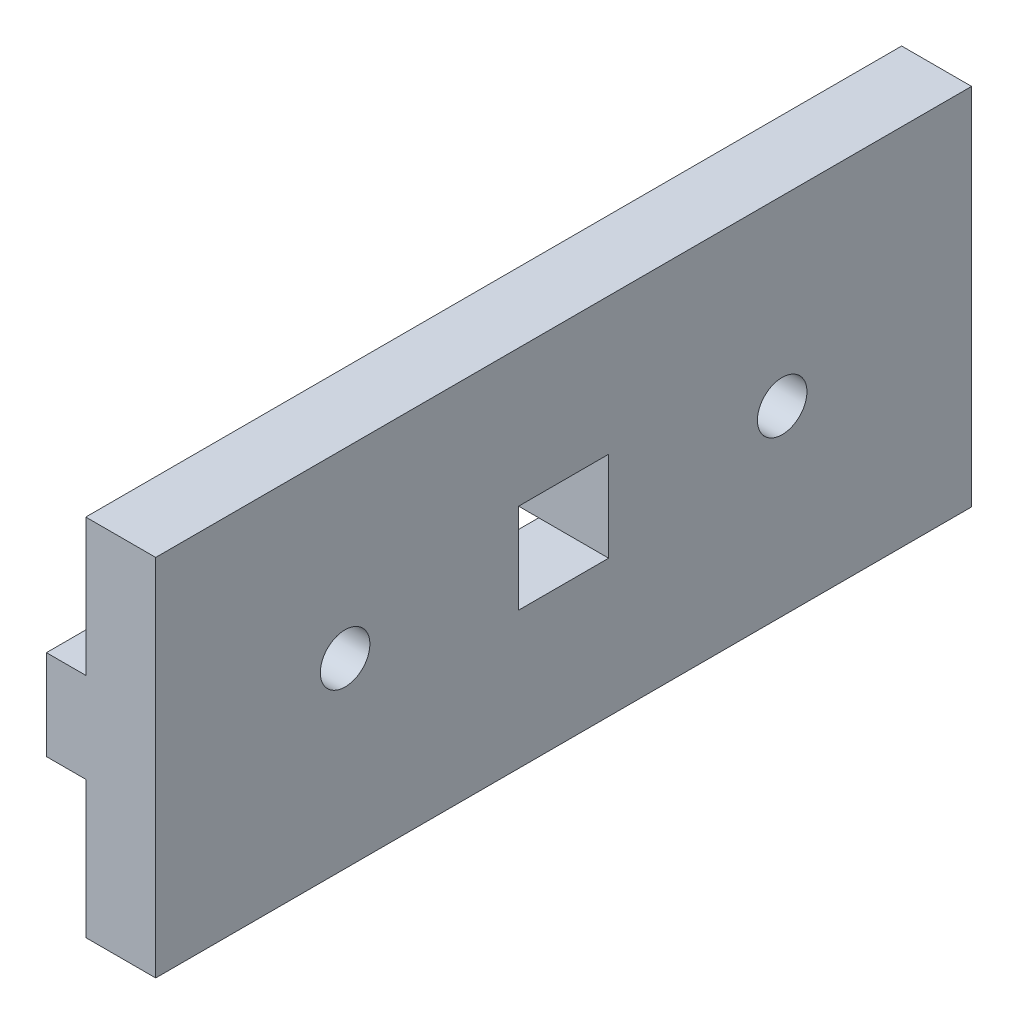
ISO-10303-21;
HEADER;
FILE_DESCRIPTION(('STEP AP214'),'2;1');
FILE_NAME('part.step','',(''),(''),'','','');
FILE_SCHEMA(('AUTOMOTIVE_DESIGN { 1 0 10303 214 1 1 1 1 }'));
ENDSEC;
DATA;
#1=APPLICATION_CONTEXT('core data for automotive mechanical design processes');
#2=APPLICATION_PROTOCOL_DEFINITION('international standard','automotive_design',2000,#1);
#3=PRODUCT_CONTEXT('',#1,'mechanical');
#4=PRODUCT('Part','Part','',(#3));
#5=PRODUCT_RELATED_PRODUCT_CATEGORY('part','',(#4));
#6=PRODUCT_DEFINITION_FORMATION('','',#4);
#7=PRODUCT_DEFINITION_CONTEXT('part definition',#1,'design');
#8=PRODUCT_DEFINITION('design','',#6,#7);
#9=PRODUCT_DEFINITION_SHAPE('','',#8);
#10=(LENGTH_UNIT() NAMED_UNIT(*) SI_UNIT(.MILLI.,.METRE.));
#11=(NAMED_UNIT(*) PLANE_ANGLE_UNIT() SI_UNIT($,.RADIAN.));
#12=(NAMED_UNIT(*) SI_UNIT($,.STERADIAN.) SOLID_ANGLE_UNIT());
#13=UNCERTAINTY_MEASURE_WITH_UNIT(LENGTH_MEASURE(1.E-05),#10,'distance_accuracy_value','');
#14=(GEOMETRIC_REPRESENTATION_CONTEXT(3) GLOBAL_UNCERTAINTY_ASSIGNED_CONTEXT((#13)) GLOBAL_UNIT_ASSIGNED_CONTEXT((#10,
#11,#12)) REPRESENTATION_CONTEXT('',''));
#15=CARTESIAN_POINT('',(0.,0.,0.));
#16=DIRECTION('',(0.,0.,1.));
#17=DIRECTION('',(1.,0.,0.));
#18=AXIS2_PLACEMENT_3D('',#15,#16,#17);
#19=CARTESIAN_POINT('',(12.5568958762887,7.8486,71.12));
#20=DIRECTION('',(0.,-1.,0.));
#21=DIRECTION('',(0.,0.,-1.));
#22=AXIS2_PLACEMENT_3D('',#19,#20,#21);
#23=PLANE('',#22);
#24=DIRECTION('',(-1.,0.,0.));
#25=VECTOR('',#24,1.);
#26=CARTESIAN_POINT('',(18.6538958762887,7.8486,31.6357));
#27=LINE('',#26,#25);
#28=CARTESIAN_POINT('',(12.5568958762887,7.8486,31.6357));
#29=VERTEX_POINT('',#28);
#30=CARTESIAN_POINT('',(9.12789587628867,7.8486,31.6357));
#31=VERTEX_POINT('',#30);
#32=EDGE_CURVE('E226',#29,#31,#27,.T.);
#33=ORIENTED_EDGE('',*,*,#32,.F.);
#34=DIRECTION('',(0.,0.,-1.));
#35=VECTOR('',#34,1.);
#36=CARTESIAN_POINT('',(12.5568958762887,7.8486,71.12));
#37=LINE('',#36,#35);
#38=CARTESIAN_POINT('',(12.5568958762887,7.8486,21.0487079119503));
#39=VERTEX_POINT('',#38);
#40=EDGE_CURVE('E372',#29,#39,#37,.T.);
#41=ORIENTED_EDGE('',*,*,#40,.T.);
#42=DIRECTION('',(-1.,0.,0.));
#43=VECTOR('',#42,1.);
#44=CARTESIAN_POINT('',(13.1278958762887,7.8486,21.0487079119503));
#45=LINE('',#44,#43);
#46=CARTESIAN_POINT('',(9.12789587628867,7.8486,21.0487079119503));
#47=VERTEX_POINT('',#46);
#48=EDGE_CURVE('E296',#39,#47,#45,.T.);
#49=ORIENTED_EDGE('',*,*,#48,.T.);
#50=DIRECTION('',(0.,0.,-1.));
#51=VECTOR('',#50,1.);
#52=CARTESIAN_POINT('',(9.12789587628867,7.8486,71.12));
#53=LINE('',#52,#51);
#54=EDGE_CURVE('E407',#31,#47,#53,.T.);
#55=ORIENTED_EDGE('',*,*,#54,.F.);
#56=EDGE_LOOP('',(#33,#41,#49,#55));
#57=FACE_BOUND('',#56,.T.);
#58=ADVANCED_FACE('F39',(#57),#23,.F.);
#59=CARTESIAN_POINT('',(9.12789587628867,7.8486,71.12));
#60=DIRECTION('',(1.,0.,0.));
#61=DIRECTION('',(0.,0.,-1.));
#62=AXIS2_PLACEMENT_3D('',#59,#60,#61);
#63=PLANE('',#62);
#64=DIRECTION('',(0.,1.,0.));
#65=VECTOR('',#64,1.);
#66=CARTESIAN_POINT('',(9.12789587628867,0.,31.6357));
#67=LINE('',#66,#65);
#68=CARTESIAN_POINT('',(9.12789587628867,0.,31.6357));
#69=VERTEX_POINT('',#68);
#70=EDGE_CURVE('E222',#69,#31,#67,.T.);
#71=ORIENTED_EDGE('',*,*,#70,.T.);
#72=ORIENTED_EDGE('',*,*,#54,.T.);
#73=CARTESIAN_POINT('',(9.12789587628867,3.9243,16.51));
#74=DIRECTION('',(-1.,0.,0.));
#75=DIRECTION('',(0.,0.,1.));
#76=AXIS2_PLACEMENT_3D('',#73,#74,#75);
#77=CIRCLE('',#76,6.);
#78=CARTESIAN_POINT('',(9.12789587628867,0.,21.0487079119503));
#79=VERTEX_POINT('',#78);
#80=EDGE_CURVE('E262',#79,#47,#77,.T.);
#81=ORIENTED_EDGE('',*,*,#80,.F.);
#82=DIRECTION('',(0.,0.,-1.));
#83=VECTOR('',#82,1.);
#84=CARTESIAN_POINT('',(9.12789587628867,0.,71.12));
#85=LINE('',#84,#83);
#86=EDGE_CURVE('E402',#69,#79,#85,.T.);
#87=ORIENTED_EDGE('',*,*,#86,.F.);
#88=EDGE_LOOP('',(#71,#72,#81,#87));
#89=FACE_BOUND('',#88,.T.);
#90=ADVANCED_FACE('F461',(#89),#63,.F.);
#91=CARTESIAN_POINT('',(9.12789587628867,0.,71.12));
#92=DIRECTION('',(0.,1.,0.));
#93=DIRECTION('',(0.,0.,1.));
#94=AXIS2_PLACEMENT_3D('',#91,#92,#93);
#95=PLANE('',#94);
#96=DIRECTION('',(-1.,0.,0.));
#97=VECTOR('',#96,1.);
#98=CARTESIAN_POINT('',(18.6538958762887,0.,31.6357));
#99=LINE('',#98,#97);
#100=CARTESIAN_POINT('',(12.5568958762887,0.,31.6357));
#101=VERTEX_POINT('',#100);
#102=EDGE_CURVE('E229',#101,#69,#99,.T.);
#103=ORIENTED_EDGE('',*,*,#102,.T.);
#104=ORIENTED_EDGE('',*,*,#86,.T.);
#105=DIRECTION('',(-1.,0.,0.));
#106=VECTOR('',#105,1.);
#107=CARTESIAN_POINT('',(13.1278958762887,0.,21.0487079119503));
#108=LINE('',#107,#106);
#109=CARTESIAN_POINT('',(12.5568958762887,0.,21.0487079119503));
#110=VERTEX_POINT('',#109);
#111=EDGE_CURVE('E304',#79,#110,#108,.F.);
#112=ORIENTED_EDGE('',*,*,#111,.T.);
#113=DIRECTION('',(0.,0.,-1.));
#114=VECTOR('',#113,1.);
#115=CARTESIAN_POINT('',(12.5568958762887,0.,71.12));
#116=LINE('',#115,#114);
#117=EDGE_CURVE('E395',#101,#110,#116,.T.);
#118=ORIENTED_EDGE('',*,*,#117,.F.);
#119=EDGE_LOOP('',(#103,#104,#112,#118));
#120=FACE_BOUND('',#119,.T.);
#121=ADVANCED_FACE('F478',(#120),#95,.F.);
#122=CARTESIAN_POINT('',(12.5568958762887,7.8486,50.0712920880497));
#123=VERTEX_POINT('',#122);
#124=CARTESIAN_POINT('',(12.5568958762887,7.8486,39.4843));
#125=VERTEX_POINT('',#124);
#126=EDGE_CURVE('E371',#123,#125,#37,.T.);
#127=ORIENTED_EDGE('',*,*,#126,.T.);
#128=DIRECTION('',(-1.,0.,0.));
#129=VECTOR('',#128,1.);
#130=CARTESIAN_POINT('',(18.6538958762887,7.8486,39.4843));
#131=LINE('',#130,#129);
#132=CARTESIAN_POINT('',(9.12789587628867,7.8486,39.4843));
#133=VERTEX_POINT('',#132);
#134=EDGE_CURVE('E207',#125,#133,#131,.T.);
#135=ORIENTED_EDGE('',*,*,#134,.T.);
#136=CARTESIAN_POINT('',(9.12789587628867,7.8486,50.0712920880497));
#137=VERTEX_POINT('',#136);
#138=EDGE_CURVE('E406',#137,#133,#53,.T.);
#139=ORIENTED_EDGE('',*,*,#138,.F.);
#140=DIRECTION('',(-1.,0.,0.));
#141=VECTOR('',#140,1.);
#142=CARTESIAN_POINT('',(13.1278958762887,7.8486,50.0712920880497));
#143=LINE('',#142,#141);
#144=EDGE_CURVE('E260',#137,#123,#143,.F.);
#145=ORIENTED_EDGE('',*,*,#144,.T.);
#146=EDGE_LOOP('',(#127,#135,#139,#145));
#147=FACE_BOUND('',#146,.T.);
#148=ADVANCED_FACE('F520',(#147),#23,.F.);
#149=CARTESIAN_POINT('',(12.5568958762887,7.8486,71.12));
#150=VERTEX_POINT('',#149);
#151=CARTESIAN_POINT('',(12.5568958762887,7.8486,59.1487079119503));
#152=VERTEX_POINT('',#151);
#153=EDGE_CURVE('E366',#150,#152,#37,.T.);
#154=ORIENTED_EDGE('',*,*,#153,.T.);
#155=DIRECTION('',(-1.,0.,0.));
#156=VECTOR('',#155,1.);
#157=CARTESIAN_POINT('',(13.1278958762887,7.8486,59.1487079119503));
#158=LINE('',#157,#156);
#159=CARTESIAN_POINT('',(9.12789587628867,7.8486,59.1487079119503));
#160=VERTEX_POINT('',#159);
#161=EDGE_CURVE('E276',#152,#160,#158,.T.);
#162=ORIENTED_EDGE('',*,*,#161,.T.);
#163=CARTESIAN_POINT('',(9.12789587628867,7.8486,71.12));
#164=VERTEX_POINT('',#163);
#165=EDGE_CURVE('E403',#164,#160,#53,.T.);
#166=ORIENTED_EDGE('',*,*,#165,.F.);
#167=DIRECTION('',(-1.,0.,0.));
#168=VECTOR('',#167,1.);
#169=CARTESIAN_POINT('',(12.5568958762887,7.8486,71.12));
#170=LINE('',#169,#168);
#171=EDGE_CURVE('E313',#150,#164,#170,.T.);
#172=ORIENTED_EDGE('',*,*,#171,.F.);
#173=EDGE_LOOP('',(#154,#162,#166,#172));
#174=FACE_BOUND('',#173,.T.);
#175=ADVANCED_FACE('F421',(#174),#23,.F.);
#176=ORIENTED_EDGE('',*,*,#138,.T.);
#177=DIRECTION('',(0.,1.,0.));
#178=VECTOR('',#177,1.);
#179=CARTESIAN_POINT('',(9.12789587628867,0.,39.4843));
#180=LINE('',#179,#178);
#181=CARTESIAN_POINT('',(9.12789587628867,0.,39.4843));
#182=VERTEX_POINT('',#181);
#183=EDGE_CURVE('E219',#182,#133,#180,.T.);
#184=ORIENTED_EDGE('',*,*,#183,.F.);
#185=CARTESIAN_POINT('',(9.12789587628867,0.,50.0712920880497));
#186=VERTEX_POINT('',#185);
#187=EDGE_CURVE('E401',#186,#182,#85,.T.);
#188=ORIENTED_EDGE('',*,*,#187,.F.);
#189=CARTESIAN_POINT('',(9.12789587628867,3.9243,54.61));
#190=DIRECTION('',(-1.,0.,0.));
#191=DIRECTION('',(0.,0.,1.));
#192=AXIS2_PLACEMENT_3D('',#189,#190,#191);
#193=CIRCLE('',#192,6.);
#194=EDGE_CURVE('E266',#137,#186,#193,.T.);
#195=ORIENTED_EDGE('',*,*,#194,.F.);
#196=EDGE_LOOP('',(#176,#184,#188,#195));
#197=FACE_BOUND('',#196,.T.);
#198=ADVANCED_FACE('F510',(#197),#63,.F.);
#199=ORIENTED_EDGE('',*,*,#165,.T.);
#200=CARTESIAN_POINT('',(9.12789587628867,0.,59.1487079119503));
#201=VERTEX_POINT('',#200);
#202=EDGE_CURVE('E267',#201,#160,#193,.T.);
#203=ORIENTED_EDGE('',*,*,#202,.F.);
#204=CARTESIAN_POINT('',(9.12789587628867,0.,71.12));
#205=VERTEX_POINT('',#204);
#206=EDGE_CURVE('E396',#205,#201,#85,.T.);
#207=ORIENTED_EDGE('',*,*,#206,.F.);
#208=DIRECTION('',(0.,-1.,0.));
#209=VECTOR('',#208,1.);
#210=CARTESIAN_POINT('',(9.12789587628867,7.8486,71.12));
#211=LINE('',#210,#209);
#212=EDGE_CURVE('E317',#164,#205,#211,.T.);
#213=ORIENTED_EDGE('',*,*,#212,.F.);
#214=EDGE_LOOP('',(#199,#203,#207,#213));
#215=FACE_BOUND('',#214,.T.);
#216=ADVANCED_FACE('F508',(#215),#63,.F.);
#217=CARTESIAN_POINT('',(12.5568958762887,0.,11.9712920880497));
#218=VERTEX_POINT('',#217);
#219=CARTESIAN_POINT('',(12.5568958762887,0.,0.));
#220=VERTEX_POINT('',#219);
#221=EDGE_CURVE('E388',#218,#220,#116,.T.);
#222=ORIENTED_EDGE('',*,*,#221,.F.);
#223=DIRECTION('',(-1.,0.,0.));
#224=VECTOR('',#223,1.);
#225=CARTESIAN_POINT('',(13.1278958762887,0.,11.9712920880497));
#226=LINE('',#225,#224);
#227=CARTESIAN_POINT('',(9.12789587628867,0.,11.9712920880497));
#228=VERTEX_POINT('',#227);
#229=EDGE_CURVE('E308',#218,#228,#226,.T.);
#230=ORIENTED_EDGE('',*,*,#229,.T.);
#231=CARTESIAN_POINT('',(9.12789587628867,0.,0.));
#232=VERTEX_POINT('',#231);
#233=EDGE_CURVE('E393',#228,#232,#85,.T.);
#234=ORIENTED_EDGE('',*,*,#233,.T.);
#235=DIRECTION('',(1.,0.,0.));
#236=VECTOR('',#235,1.);
#237=CARTESIAN_POINT('',(9.12789587628867,0.,0.));
#238=LINE('',#237,#236);
#239=EDGE_CURVE('E347',#232,#220,#238,.T.);
#240=ORIENTED_EDGE('',*,*,#239,.T.);
#241=EDGE_LOOP('',(#222,#230,#234,#240));
#242=FACE_BOUND('',#241,.T.);
#243=ADVANCED_FACE('F491',(#242),#95,.F.);
#244=ORIENTED_EDGE('',*,*,#187,.T.);
#245=DIRECTION('',(-1.,0.,0.));
#246=VECTOR('',#245,1.);
#247=CARTESIAN_POINT('',(18.6538958762887,0.,39.4843));
#248=LINE('',#247,#246);
#249=CARTESIAN_POINT('',(12.5568958762887,0.,39.4843));
#250=VERTEX_POINT('',#249);
#251=EDGE_CURVE('E208',#250,#182,#248,.T.);
#252=ORIENTED_EDGE('',*,*,#251,.F.);
#253=CARTESIAN_POINT('',(12.5568958762887,0.,50.0712920880497));
#254=VERTEX_POINT('',#253);
#255=EDGE_CURVE('E394',#254,#250,#116,.T.);
#256=ORIENTED_EDGE('',*,*,#255,.F.);
#257=DIRECTION('',(-1.,0.,0.));
#258=VECTOR('',#257,1.);
#259=CARTESIAN_POINT('',(13.1278958762887,0.,50.0712920880497));
#260=LINE('',#259,#258);
#261=EDGE_CURVE('E288',#254,#186,#260,.T.);
#262=ORIENTED_EDGE('',*,*,#261,.T.);
#263=EDGE_LOOP('',(#244,#252,#256,#262));
#264=FACE_BOUND('',#263,.T.);
#265=ADVANCED_FACE('F515',(#264),#95,.F.);
#266=CARTESIAN_POINT('',(9.12789587628867,7.8486,11.9712920880497));
#267=VERTEX_POINT('',#266);
#268=CARTESIAN_POINT('',(9.12789587628867,7.8486,0.));
#269=VERTEX_POINT('',#268);
#270=EDGE_CURVE('E400',#267,#269,#53,.T.);
#271=ORIENTED_EDGE('',*,*,#270,.F.);
#272=DIRECTION('',(-1.,0.,0.));
#273=VECTOR('',#272,1.);
#274=CARTESIAN_POINT('',(13.1278958762887,7.8486,11.9712920880497));
#275=LINE('',#274,#273);
#276=CARTESIAN_POINT('',(12.5568958762887,7.8486,11.9712920880497));
#277=VERTEX_POINT('',#276);
#278=EDGE_CURVE('E292',#267,#277,#275,.F.);
#279=ORIENTED_EDGE('',*,*,#278,.T.);
#280=CARTESIAN_POINT('',(12.5568958762887,7.8486,0.));
#281=VERTEX_POINT('',#280);
#282=EDGE_CURVE('E339',#277,#281,#37,.T.);
#283=ORIENTED_EDGE('',*,*,#282,.T.);
#284=DIRECTION('',(-1.,0.,0.));
#285=VECTOR('',#284,1.);
#286=CARTESIAN_POINT('',(12.5568958762887,7.8486,0.));
#287=LINE('',#286,#285);
#288=EDGE_CURVE('E312',#281,#269,#287,.T.);
#289=ORIENTED_EDGE('',*,*,#288,.T.);
#290=EDGE_LOOP('',(#271,#279,#283,#289));
#291=FACE_BOUND('',#290,.T.);
#292=ADVANCED_FACE('F41',(#291),#23,.F.);
#293=ORIENTED_EDGE('',*,*,#233,.F.);
#294=EDGE_CURVE('E261',#267,#228,#77,.T.);
#295=ORIENTED_EDGE('',*,*,#294,.F.);
#296=ORIENTED_EDGE('',*,*,#270,.T.);
#297=DIRECTION('',(0.,-1.,0.));
#298=VECTOR('',#297,1.);
#299=CARTESIAN_POINT('',(9.12789587628867,7.8486,0.));
#300=LINE('',#299,#298);
#301=EDGE_CURVE('E343',#269,#232,#300,.T.);
#302=ORIENTED_EDGE('',*,*,#301,.T.);
#303=EDGE_LOOP('',(#293,#295,#296,#302));
#304=FACE_BOUND('',#303,.T.);
#305=ADVANCED_FACE('F468',(#304),#63,.F.);
#306=ORIENTED_EDGE('',*,*,#206,.T.);
#307=DIRECTION('',(-1.,0.,0.));
#308=VECTOR('',#307,1.);
#309=CARTESIAN_POINT('',(13.1278958762887,0.,59.1487079119503));
#310=LINE('',#309,#308);
#311=CARTESIAN_POINT('',(12.5568958762887,0.,59.1487079119503));
#312=VERTEX_POINT('',#311);
#313=EDGE_CURVE('E284',#201,#312,#310,.F.);
#314=ORIENTED_EDGE('',*,*,#313,.T.);
#315=CARTESIAN_POINT('',(12.5568958762887,0.,71.12));
#316=VERTEX_POINT('',#315);
#317=EDGE_CURVE('E389',#316,#312,#116,.T.);
#318=ORIENTED_EDGE('',*,*,#317,.F.);
#319=DIRECTION('',(1.,0.,0.));
#320=VECTOR('',#319,1.);
#321=CARTESIAN_POINT('',(9.12789587628867,0.,71.12));
#322=LINE('',#321,#320);
#323=EDGE_CURVE('E321',#205,#316,#322,.T.);
#324=ORIENTED_EDGE('',*,*,#323,.F.);
#325=EDGE_LOOP('',(#306,#314,#318,#324));
#326=FACE_BOUND('',#325,.T.);
#327=ADVANCED_FACE('F504',(#326),#95,.F.);
#328=CARTESIAN_POINT('',(12.5568958762887,0.,71.12));
#329=DIRECTION('',(1.,0.,0.));
#330=DIRECTION('',(0.,0.,-1.));
#331=AXIS2_PLACEMENT_3D('',#328,#329,#330);
#332=PLANE('',#331);
#333=ORIENTED_EDGE('',*,*,#255,.T.);
#334=DIRECTION('',(0.,0.,-1.));
#335=VECTOR('',#334,1.);
#336=CARTESIAN_POINT('',(12.5568958762887,0.,71.12));
#337=LINE('',#336,#335);
#338=EDGE_CURVE('E205',#250,#101,#337,.T.);
#339=ORIENTED_EDGE('',*,*,#338,.T.);
#340=ORIENTED_EDGE('',*,*,#117,.T.);
#341=CARTESIAN_POINT('',(12.5568958762887,3.9243,16.51));
#342=DIRECTION('',(1.,0.,0.));
#343=DIRECTION('',(0.,0.,-1.));
#344=AXIS2_PLACEMENT_3D('',#341,#342,#343);
#345=CIRCLE('',#344,6.);
#346=EDGE_CURVE('E300',#110,#218,#345,.T.);
#347=ORIENTED_EDGE('',*,*,#346,.T.);
#348=ORIENTED_EDGE('',*,*,#221,.T.);
#349=DIRECTION('',(0.,-1.,0.));
#350=VECTOR('',#349,1.);
#351=CARTESIAN_POINT('',(12.5568958762887,0.,0.));
#352=LINE('',#351,#350);
#353=CARTESIAN_POINT('',(12.5568958762887,-11.9507,0.));
#354=VERTEX_POINT('',#353);
#355=EDGE_CURVE('E351',#220,#354,#352,.T.);
#356=ORIENTED_EDGE('',*,*,#355,.T.);
#357=DIRECTION('',(0.,0.,-1.));
#358=VECTOR('',#357,1.);
#359=CARTESIAN_POINT('',(12.5568958762887,-11.9507,71.12));
#360=LINE('',#359,#358);
#361=CARTESIAN_POINT('',(12.5568958762887,-11.9507,71.12));
#362=VERTEX_POINT('',#361);
#363=EDGE_CURVE('E384',#362,#354,#360,.T.);
#364=ORIENTED_EDGE('',*,*,#363,.F.);
#365=DIRECTION('',(0.,-1.,0.));
#366=VECTOR('',#365,1.);
#367=CARTESIAN_POINT('',(12.5568958762887,0.,71.12));
#368=LINE('',#367,#366);
#369=EDGE_CURVE('E324',#316,#362,#368,.T.);
#370=ORIENTED_EDGE('',*,*,#369,.F.);
#371=ORIENTED_EDGE('',*,*,#317,.T.);
#372=CARTESIAN_POINT('',(12.5568958762887,3.9243,54.61));
#373=DIRECTION('',(1.,0.,0.));
#374=DIRECTION('',(0.,0.,-1.));
#375=AXIS2_PLACEMENT_3D('',#372,#373,#374);
#376=CIRCLE('',#375,6.);
#377=EDGE_CURVE('E280',#312,#254,#376,.T.);
#378=ORIENTED_EDGE('',*,*,#377,.T.);
#379=EDGE_LOOP('',(#333,#339,#340,#347,#348,#356,#364,#370,#371,#378));
#380=FACE_BOUND('',#379,.T.);
#381=ADVANCED_FACE('F482',(#380),#332,.F.);
#382=CARTESIAN_POINT('',(12.5568958762887,-11.9507,71.12));
#383=DIRECTION('',(0.,1.,0.));
#384=DIRECTION('',(0.,0.,1.));
#385=AXIS2_PLACEMENT_3D('',#382,#383,#384);
#386=PLANE('',#385);
#387=DIRECTION('',(1.,0.,0.));
#388=VECTOR('',#387,1.);
#389=CARTESIAN_POINT('',(12.5568958762887,-11.9507,0.));
#390=LINE('',#389,#388);
#391=CARTESIAN_POINT('',(18.6528958762887,-11.9507,0.));
#392=VERTEX_POINT('',#391);
#393=EDGE_CURVE('E354',#354,#392,#390,.T.);
#394=ORIENTED_EDGE('',*,*,#393,.T.);
#395=DIRECTION('',(0.,0.,-1.));
#396=VECTOR('',#395,1.);
#397=CARTESIAN_POINT('',(18.6528958762887,-11.9507,71.12));
#398=LINE('',#397,#396);
#399=CARTESIAN_POINT('',(18.6528958762887,-11.9507,71.12));
#400=VERTEX_POINT('',#399);
#401=EDGE_CURVE('E380',#400,#392,#398,.T.);
#402=ORIENTED_EDGE('',*,*,#401,.F.);
#403=DIRECTION('',(1.,0.,0.));
#404=VECTOR('',#403,1.);
#405=CARTESIAN_POINT('',(12.5568958762887,-11.9507,71.12));
#406=LINE('',#405,#404);
#407=EDGE_CURVE('E327',#362,#400,#406,.T.);
#408=ORIENTED_EDGE('',*,*,#407,.F.);
#409=ORIENTED_EDGE('',*,*,#363,.T.);
#410=EDGE_LOOP('',(#394,#402,#408,#409));
#411=FACE_BOUND('',#410,.T.);
#412=ADVANCED_FACE('F495',(#411),#386,.F.);
#413=CARTESIAN_POINT('',(18.6528958762887,-11.9507,71.12));
#414=DIRECTION('',(-1.,0.,0.));
#415=DIRECTION('',(0.,0.,1.));
#416=AXIS2_PLACEMENT_3D('',#413,#414,#415);
#417=PLANE('',#416);
#418=DIRECTION('',(0.,0.,-1.));
#419=VECTOR('',#418,1.);
#420=CARTESIAN_POINT('',(18.6528958762887,0.,31.6357));
#421=LINE('',#420,#419);
#422=CARTESIAN_POINT('',(18.6528958762887,0.,39.4843));
#423=VERTEX_POINT('',#422);
#424=CARTESIAN_POINT('',(18.6528958762887,0.,31.6357));
#425=VERTEX_POINT('',#424);
#426=EDGE_CURVE('E198',#423,#425,#421,.T.);
#427=ORIENTED_EDGE('',*,*,#426,.F.);
#428=DIRECTION('',(0.,-1.,0.));
#429=VECTOR('',#428,1.);
#430=CARTESIAN_POINT('',(18.6528958762887,0.,39.4843));
#431=LINE('',#430,#429);
#432=CARTESIAN_POINT('',(18.6528958762887,7.8486,39.4843));
#433=VERTEX_POINT('',#432);
#434=EDGE_CURVE('E188',#433,#423,#431,.T.);
#435=ORIENTED_EDGE('',*,*,#434,.F.);
#436=DIRECTION('',(0.,0.,-1.));
#437=VECTOR('',#436,1.);
#438=CARTESIAN_POINT('',(18.6528958762887,7.8486,31.6357));
#439=LINE('',#438,#437);
#440=CARTESIAN_POINT('',(18.6528958762887,7.8486,31.6357));
#441=VERTEX_POINT('',#440);
#442=EDGE_CURVE('E197',#433,#441,#439,.T.);
#443=ORIENTED_EDGE('',*,*,#442,.T.);
#444=DIRECTION('',(0.,-1.,0.));
#445=VECTOR('',#444,1.);
#446=CARTESIAN_POINT('',(18.6528958762887,0.,31.6357));
#447=LINE('',#446,#445);
#448=EDGE_CURVE('E213',#441,#425,#447,.T.);
#449=ORIENTED_EDGE('',*,*,#448,.T.);
#450=EDGE_LOOP('',(#427,#435,#443,#449));
#451=FACE_BOUND('',#450,.T.);
#452=CARTESIAN_POINT('',(18.6528958762887,3.9243,16.51));
#453=DIRECTION('',(-1.,0.,0.));
#454=DIRECTION('',(0.,0.,1.));
#455=AXIS2_PLACEMENT_3D('',#452,#453,#454);
#456=CIRCLE('',#455,2.16);
#457=CARTESIAN_POINT('',(18.6528958762887,3.9243,18.67));
#458=VERTEX_POINT('',#457);
#459=EDGE_CURVE('E244',#458,#458,#456,.F.);
#460=ORIENTED_EDGE('',*,*,#459,.F.);
#461=EDGE_LOOP('',(#460));
#462=FACE_BOUND('',#461,.T.);
#463=CARTESIAN_POINT('',(18.6528958762887,3.9243,54.61));
#464=DIRECTION('',(-1.,0.,0.));
#465=DIRECTION('',(0.,0.,1.));
#466=AXIS2_PLACEMENT_3D('',#463,#464,#465);
#467=CIRCLE('',#466,2.16);
#468=CARTESIAN_POINT('',(18.6528958762887,3.9243,56.77));
#469=VERTEX_POINT('',#468);
#470=EDGE_CURVE('E239',#469,#469,#467,.F.);
#471=ORIENTED_EDGE('',*,*,#470,.F.);
#472=EDGE_LOOP('',(#471));
#473=FACE_BOUND('',#472,.T.);
#474=DIRECTION('',(0.,1.,0.));
#475=VECTOR('',#474,1.);
#476=CARTESIAN_POINT('',(18.6528958762887,-11.9507,0.));
#477=LINE('',#476,#475);
#478=CARTESIAN_POINT('',(18.6528958762887,19.7993,0.));
#479=VERTEX_POINT('',#478);
#480=EDGE_CURVE('E357',#392,#479,#477,.T.);
#481=ORIENTED_EDGE('',*,*,#480,.T.);
#482=DIRECTION('',(0.,0.,-1.));
#483=VECTOR('',#482,1.);
#484=CARTESIAN_POINT('',(18.6528958762887,19.7993,71.12));
#485=LINE('',#484,#483);
#486=CARTESIAN_POINT('',(18.6528958762887,19.7993,71.12));
#487=VERTEX_POINT('',#486);
#488=EDGE_CURVE('E376',#487,#479,#485,.T.);
#489=ORIENTED_EDGE('',*,*,#488,.F.);
#490=DIRECTION('',(0.,1.,0.));
#491=VECTOR('',#490,1.);
#492=CARTESIAN_POINT('',(18.6528958762887,-11.9507,71.12));
#493=LINE('',#492,#491);
#494=EDGE_CURVE('E330',#400,#487,#493,.T.);
#495=ORIENTED_EDGE('',*,*,#494,.F.);
#496=ORIENTED_EDGE('',*,*,#401,.T.);
#497=EDGE_LOOP('',(#481,#489,#495,#496));
#498=FACE_BOUND('',#497,.T.);
#499=ADVANCED_FACE('F211',(#451,#462,#473,#498),#417,.F.);
#500=CARTESIAN_POINT('',(18.6528958762887,19.7993,71.12));
#501=DIRECTION('',(0.,-1.,0.));
#502=DIRECTION('',(0.,0.,-1.));
#503=AXIS2_PLACEMENT_3D('',#500,#501,#502);
#504=PLANE('',#503);
#505=DIRECTION('',(-1.,0.,0.));
#506=VECTOR('',#505,1.);
#507=CARTESIAN_POINT('',(18.6528958762887,19.7993,0.));
#508=LINE('',#507,#506);
#509=CARTESIAN_POINT('',(12.5568958762887,19.7993,0.));
#510=VERTEX_POINT('',#509);
#511=EDGE_CURVE('E360',#479,#510,#508,.T.);
#512=ORIENTED_EDGE('',*,*,#511,.T.);
#513=DIRECTION('',(0.,0.,-1.));
#514=VECTOR('',#513,1.);
#515=CARTESIAN_POINT('',(12.5568958762887,19.7993,71.12));
#516=LINE('',#515,#514);
#517=CARTESIAN_POINT('',(12.5568958762887,19.7993,71.12));
#518=VERTEX_POINT('',#517);
#519=EDGE_CURVE('E370',#518,#510,#516,.T.);
#520=ORIENTED_EDGE('',*,*,#519,.F.);
#521=DIRECTION('',(-1.,0.,0.));
#522=VECTOR('',#521,1.);
#523=CARTESIAN_POINT('',(18.6528958762887,19.7993,71.12));
#524=LINE('',#523,#522);
#525=EDGE_CURVE('E333',#487,#518,#524,.T.);
#526=ORIENTED_EDGE('',*,*,#525,.F.);
#527=ORIENTED_EDGE('',*,*,#488,.T.);
#528=EDGE_LOOP('',(#512,#520,#526,#527));
#529=FACE_BOUND('',#528,.T.);
#530=ADVANCED_FACE('F574',(#529),#504,.F.);
#531=CARTESIAN_POINT('',(12.5568958762887,19.7993,71.12));
#532=DIRECTION('',(1.,0.,0.));
#533=DIRECTION('',(0.,0.,-1.));
#534=AXIS2_PLACEMENT_3D('',#531,#532,#533);
#535=PLANE('',#534);
#536=ORIENTED_EDGE('',*,*,#282,.F.);
#537=CARTESIAN_POINT('',(12.5568958762887,3.9243,16.51));
#538=DIRECTION('',(1.,0.,0.));
#539=DIRECTION('',(0.,0.,-1.));
#540=AXIS2_PLACEMENT_3D('',#537,#538,#539);
#541=CIRCLE('',#540,6.);
#542=EDGE_CURVE('E11',#277,#39,#541,.T.);
#543=ORIENTED_EDGE('',*,*,#542,.T.);
#544=ORIENTED_EDGE('',*,*,#40,.F.);
#545=EDGE_CURVE('E440',#125,#29,#37,.T.);
#546=ORIENTED_EDGE('',*,*,#545,.F.);
#547=ORIENTED_EDGE('',*,*,#126,.F.);
#548=CARTESIAN_POINT('',(12.5568958762887,3.9243,54.61));
#549=DIRECTION('',(1.,0.,0.));
#550=DIRECTION('',(0.,0.,-1.));
#551=AXIS2_PLACEMENT_3D('',#548,#549,#550);
#552=CIRCLE('',#551,6.);
#553=EDGE_CURVE('E48',#123,#152,#552,.T.);
#554=ORIENTED_EDGE('',*,*,#553,.T.);
#555=ORIENTED_EDGE('',*,*,#153,.F.);
#556=DIRECTION('',(0.,-1.,0.));
#557=VECTOR('',#556,1.);
#558=CARTESIAN_POINT('',(12.5568958762887,19.7993,71.12));
#559=LINE('',#558,#557);
#560=EDGE_CURVE('E336',#518,#150,#559,.T.);
#561=ORIENTED_EDGE('',*,*,#560,.F.);
#562=ORIENTED_EDGE('',*,*,#519,.T.);
#563=DIRECTION('',(0.,-1.,0.));
#564=VECTOR('',#563,1.);
#565=CARTESIAN_POINT('',(12.5568958762887,19.7993,0.));
#566=LINE('',#565,#564);
#567=EDGE_CURVE('E318',#510,#281,#566,.T.);
#568=ORIENTED_EDGE('',*,*,#567,.T.);
#569=EDGE_LOOP('',(#536,#543,#544,#546,#547,#554,#555,#561,#562,#568));
#570=FACE_BOUND('',#569,.T.);
#571=ADVANCED_FACE('F414',(#570),#535,.F.);
#572=CARTESIAN_POINT('',(0.,0.,71.12));
#573=DIRECTION('',(0.,0.,1.));
#574=DIRECTION('',(1.,0.,0.));
#575=AXIS2_PLACEMENT_3D('',#572,#573,#574);
#576=PLANE('',#575);
#577=ORIENTED_EDGE('',*,*,#171,.T.);
#578=ORIENTED_EDGE('',*,*,#212,.T.);
#579=ORIENTED_EDGE('',*,*,#323,.T.);
#580=ORIENTED_EDGE('',*,*,#369,.T.);
#581=ORIENTED_EDGE('',*,*,#407,.T.);
#582=ORIENTED_EDGE('',*,*,#494,.T.);
#583=ORIENTED_EDGE('',*,*,#525,.T.);
#584=ORIENTED_EDGE('',*,*,#560,.T.);
#585=EDGE_LOOP('',(#577,#578,#579,#580,#581,#582,#583,#584));
#586=FACE_BOUND('',#585,.T.);
#587=ADVANCED_FACE('F424',(#586),#576,.T.);
#588=CARTESIAN_POINT('',(0.,0.,0.));
#589=DIRECTION('',(0.,0.,1.));
#590=DIRECTION('',(1.,0.,0.));
#591=AXIS2_PLACEMENT_3D('',#588,#589,#590);
#592=PLANE('',#591);
#593=ORIENTED_EDGE('',*,*,#288,.F.);
#594=ORIENTED_EDGE('',*,*,#567,.F.);
#595=ORIENTED_EDGE('',*,*,#511,.F.);
#596=ORIENTED_EDGE('',*,*,#480,.F.);
#597=ORIENTED_EDGE('',*,*,#393,.F.);
#598=ORIENTED_EDGE('',*,*,#355,.F.);
#599=ORIENTED_EDGE('',*,*,#239,.F.);
#600=ORIENTED_EDGE('',*,*,#301,.F.);
#601=EDGE_LOOP('',(#593,#594,#595,#596,#597,#598,#599,#600));
#602=FACE_BOUND('',#601,.T.);
#603=ADVANCED_FACE('F433',(#602),#592,.F.);
#604=CARTESIAN_POINT('',(13.1278958762887,3.9243,54.61));
#605=DIRECTION('',(-1.,0.,0.));
#606=DIRECTION('',(0.,0.,1.));
#607=AXIS2_PLACEMENT_3D('',#604,#605,#606);
#608=CYLINDRICAL_SURFACE('',#607,6.);
#609=CARTESIAN_POINT('',(13.1278958762887,3.9243,54.61));
#610=DIRECTION('',(-1.,0.,0.));
#611=DIRECTION('',(0.,0.,1.));
#612=AXIS2_PLACEMENT_3D('',#609,#610,#611);
#613=CIRCLE('',#612,6.);
#614=CARTESIAN_POINT('',(13.1278958762887,3.9243,60.61));
#615=VERTEX_POINT('',#614);
#616=EDGE_CURVE('E249',#615,#615,#613,.T.);
#617=ORIENTED_EDGE('',*,*,#616,.F.);
#618=EDGE_LOOP('',(#617));
#619=FACE_BOUND('',#618,.T.);
#620=ORIENTED_EDGE('',*,*,#377,.F.);
#621=ORIENTED_EDGE('',*,*,#313,.F.);
#622=ORIENTED_EDGE('',*,*,#202,.T.);
#623=ORIENTED_EDGE('',*,*,#161,.F.);
#624=ORIENTED_EDGE('',*,*,#553,.F.);
#625=ORIENTED_EDGE('',*,*,#144,.F.);
#626=ORIENTED_EDGE('',*,*,#194,.T.);
#627=ORIENTED_EDGE('',*,*,#261,.F.);
#628=EDGE_LOOP('',(#620,#621,#622,#623,#624,#625,#626,#627));
#629=FACE_BOUND('',#628,.T.);
#630=ADVANCED_FACE('F506',(#619,#629),#608,.F.);
#631=CARTESIAN_POINT('',(13.1278958762887,3.9243,54.61));
#632=DIRECTION('',(-1.,0.,0.));
#633=DIRECTION('',(0.,0.,1.));
#634=AXIS2_PLACEMENT_3D('',#631,#632,#633);
#635=PLANE('',#634);
#636=CARTESIAN_POINT('',(13.1278958762887,3.9243,54.61));
#637=DIRECTION('',(-1.,0.,0.));
#638=DIRECTION('',(0.,0.,1.));
#639=AXIS2_PLACEMENT_3D('',#636,#637,#638);
#640=CIRCLE('',#639,2.16);
#641=CARTESIAN_POINT('',(13.1278958762887,3.9243,56.77));
#642=VERTEX_POINT('',#641);
#643=EDGE_CURVE('E245',#642,#642,#640,.T.);
#644=ORIENTED_EDGE('',*,*,#643,.F.);
#645=EDGE_LOOP('',(#644));
#646=FACE_BOUND('',#645,.T.);
#647=ORIENTED_EDGE('',*,*,#616,.T.);
#648=EDGE_LOOP('',(#647));
#649=FACE_BOUND('',#648,.T.);
#650=ADVANCED_FACE('F638',(#646,#649),#635,.T.);
#651=CARTESIAN_POINT('',(13.1278958762887,3.9243,16.51));
#652=DIRECTION('',(-1.,0.,0.));
#653=DIRECTION('',(0.,0.,1.));
#654=AXIS2_PLACEMENT_3D('',#651,#652,#653);
#655=CYLINDRICAL_SURFACE('',#654,6.);
#656=CARTESIAN_POINT('',(13.1278958762887,3.9243,16.51));
#657=DIRECTION('',(-1.,0.,0.));
#658=DIRECTION('',(0.,0.,1.));
#659=AXIS2_PLACEMENT_3D('',#656,#657,#658);
#660=CIRCLE('',#659,6.);
#661=CARTESIAN_POINT('',(13.1278958762887,3.9243,22.51));
#662=VERTEX_POINT('',#661);
#663=EDGE_CURVE('E256',#662,#662,#660,.T.);
#664=ORIENTED_EDGE('',*,*,#663,.F.);
#665=EDGE_LOOP('',(#664));
#666=FACE_BOUND('',#665,.T.);
#667=ORIENTED_EDGE('',*,*,#346,.F.);
#668=ORIENTED_EDGE('',*,*,#111,.F.);
#669=ORIENTED_EDGE('',*,*,#80,.T.);
#670=ORIENTED_EDGE('',*,*,#48,.F.);
#671=ORIENTED_EDGE('',*,*,#542,.F.);
#672=ORIENTED_EDGE('',*,*,#278,.F.);
#673=ORIENTED_EDGE('',*,*,#294,.T.);
#674=ORIENTED_EDGE('',*,*,#229,.F.);
#675=EDGE_LOOP('',(#667,#668,#669,#670,#671,#672,#673,#674));
#676=FACE_BOUND('',#675,.T.);
#677=ADVANCED_FACE('F455',(#666,#676),#655,.F.);
#678=CARTESIAN_POINT('',(13.1278958762887,3.9243,16.51));
#679=DIRECTION('',(-1.,0.,0.));
#680=DIRECTION('',(0.,0.,1.));
#681=AXIS2_PLACEMENT_3D('',#678,#679,#680);
#682=PLANE('',#681);
#683=CARTESIAN_POINT('',(13.1278958762887,3.9243,16.51));
#684=DIRECTION('',(-1.,0.,0.));
#685=DIRECTION('',(0.,0.,1.));
#686=AXIS2_PLACEMENT_3D('',#683,#684,#685);
#687=CIRCLE('',#686,2.16);
#688=CARTESIAN_POINT('',(13.1278958762887,3.9243,18.67));
#689=VERTEX_POINT('',#688);
#690=EDGE_CURVE('E240',#689,#689,#687,.T.);
#691=ORIENTED_EDGE('',*,*,#690,.F.);
#692=EDGE_LOOP('',(#691));
#693=FACE_BOUND('',#692,.T.);
#694=ORIENTED_EDGE('',*,*,#663,.T.);
#695=EDGE_LOOP('',(#694));
#696=FACE_BOUND('',#695,.T.);
#697=ADVANCED_FACE('F631',(#693,#696),#682,.T.);
#698=CARTESIAN_POINT('',(18.6538958762887,3.9243,54.61));
#699=DIRECTION('',(-1.,0.,0.));
#700=DIRECTION('',(0.,0.,1.));
#701=AXIS2_PLACEMENT_3D('',#698,#699,#700);
#702=CYLINDRICAL_SURFACE('',#701,2.16);
#703=ORIENTED_EDGE('',*,*,#643,.T.);
#704=EDGE_LOOP('',(#703));
#705=FACE_BOUND('',#704,.T.);
#706=ORIENTED_EDGE('',*,*,#470,.T.);
#707=EDGE_LOOP('',(#706));
#708=FACE_BOUND('',#707,.T.);
#709=ADVANCED_FACE('F627',(#705,#708),#702,.F.);
#710=CARTESIAN_POINT('',(18.6538958762887,3.9243,16.51));
#711=DIRECTION('',(-1.,0.,0.));
#712=DIRECTION('',(0.,0.,1.));
#713=AXIS2_PLACEMENT_3D('',#710,#711,#712);
#714=CYLINDRICAL_SURFACE('',#713,2.16);
#715=ORIENTED_EDGE('',*,*,#690,.T.);
#716=EDGE_LOOP('',(#715));
#717=FACE_BOUND('',#716,.T.);
#718=ORIENTED_EDGE('',*,*,#459,.T.);
#719=EDGE_LOOP('',(#718));
#720=FACE_BOUND('',#719,.T.);
#721=ADVANCED_FACE('F595',(#717,#720),#714,.F.);
#722=CARTESIAN_POINT('',(18.6538958762887,0.,31.6357));
#723=DIRECTION('',(0.,-1.,0.));
#724=DIRECTION('',(0.,0.,-1.));
#725=AXIS2_PLACEMENT_3D('',#722,#723,#724);
#726=PLANE('',#725);
#727=EDGE_CURVE('E191',#423,#250,#248,.T.);
#728=ORIENTED_EDGE('',*,*,#727,.F.);
#729=ORIENTED_EDGE('',*,*,#426,.T.);
#730=EDGE_CURVE('E230',#425,#101,#99,.T.);
#731=ORIENTED_EDGE('',*,*,#730,.T.);
#732=ORIENTED_EDGE('',*,*,#338,.F.);
#733=EDGE_LOOP('',(#728,#729,#731,#732));
#734=FACE_BOUND('',#733,.T.);
#735=ADVANCED_FACE('F201',(#734),#726,.F.);
#736=CARTESIAN_POINT('',(18.6538958762887,7.8486,31.6357));
#737=DIRECTION('',(0.,-1.,0.));
#738=DIRECTION('',(0.,0.,-1.));
#739=AXIS2_PLACEMENT_3D('',#736,#737,#738);
#740=PLANE('',#739);
#741=ORIENTED_EDGE('',*,*,#545,.T.);
#742=EDGE_CURVE('E55',#441,#29,#27,.T.);
#743=ORIENTED_EDGE('',*,*,#742,.F.);
#744=ORIENTED_EDGE('',*,*,#442,.F.);
#745=EDGE_CURVE('E60',#433,#125,#131,.T.);
#746=ORIENTED_EDGE('',*,*,#745,.T.);
#747=EDGE_LOOP('',(#741,#743,#744,#746));
#748=FACE_BOUND('',#747,.T.);
#749=ADVANCED_FACE('F444',(#748),#740,.T.);
#750=CARTESIAN_POINT('',(18.6538958762887,0.,39.4843));
#751=DIRECTION('',(0.,0.,1.));
#752=DIRECTION('',(1.,0.,0.));
#753=AXIS2_PLACEMENT_3D('',#750,#751,#752);
#754=PLANE('',#753);
#755=ORIENTED_EDGE('',*,*,#434,.T.);
#756=ORIENTED_EDGE('',*,*,#727,.T.);
#757=ORIENTED_EDGE('',*,*,#251,.T.);
#758=ORIENTED_EDGE('',*,*,#183,.T.);
#759=ORIENTED_EDGE('',*,*,#134,.F.);
#760=ORIENTED_EDGE('',*,*,#745,.F.);
#761=EDGE_LOOP('',(#755,#756,#757,#758,#759,#760));
#762=FACE_BOUND('',#761,.T.);
#763=ADVANCED_FACE('F190',(#762),#754,.F.);
#764=CARTESIAN_POINT('',(18.6538958762887,0.,31.6357));
#765=DIRECTION('',(0.,0.,1.));
#766=DIRECTION('',(1.,0.,0.));
#767=AXIS2_PLACEMENT_3D('',#764,#765,#766);
#768=PLANE('',#767);
#769=ORIENTED_EDGE('',*,*,#742,.T.);
#770=ORIENTED_EDGE('',*,*,#32,.T.);
#771=ORIENTED_EDGE('',*,*,#70,.F.);
#772=ORIENTED_EDGE('',*,*,#102,.F.);
#773=ORIENTED_EDGE('',*,*,#730,.F.);
#774=ORIENTED_EDGE('',*,*,#448,.F.);
#775=EDGE_LOOP('',(#769,#770,#771,#772,#773,#774));
#776=FACE_BOUND('',#775,.T.);
#777=ADVANCED_FACE('F448',(#776),#768,.T.);
#778=CLOSED_SHELL('',(#58,#90,#121,#148,#175,#198,#216,#243,#265,#292,#305,#327,#381,#412,#499,
#530,#571,#587,#603,#630,#650,#677,#697,#709,#721,#735,#749,#763,#777));
#779=MANIFOLD_SOLID_BREP('B2',#778);
#780=ADVANCED_BREP_SHAPE_REPRESENTATION('',(#18,#779),#14);
#781=SHAPE_DEFINITION_REPRESENTATION(#9,#780);
ENDSEC;
END-ISO-10303-21;
